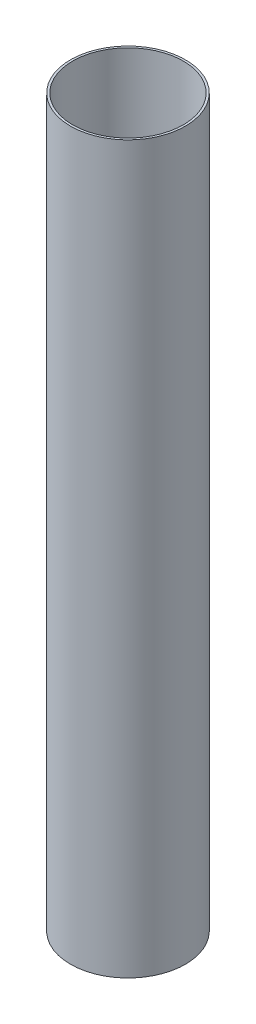
ISO-10303-21;
HEADER;
FILE_DESCRIPTION(('STEP AP214'),'2;1');
FILE_NAME('part.step','',(''),(''),'','','');
FILE_SCHEMA(('AUTOMOTIVE_DESIGN { 1 0 10303 214 1 1 1 1 }'));
ENDSEC;
DATA;
#1=APPLICATION_CONTEXT('core data for automotive mechanical design processes');
#2=APPLICATION_PROTOCOL_DEFINITION('international standard','automotive_design',2000,#1);
#3=PRODUCT_CONTEXT('',#1,'mechanical');
#4=PRODUCT('Part','Part','',(#3));
#5=PRODUCT_RELATED_PRODUCT_CATEGORY('part','',(#4));
#6=PRODUCT_DEFINITION_FORMATION('','',#4);
#7=PRODUCT_DEFINITION_CONTEXT('part definition',#1,'design');
#8=PRODUCT_DEFINITION('design','',#6,#7);
#9=PRODUCT_DEFINITION_SHAPE('','',#8);
#10=(LENGTH_UNIT() NAMED_UNIT(*) SI_UNIT(.MILLI.,.METRE.));
#11=(NAMED_UNIT(*) PLANE_ANGLE_UNIT() SI_UNIT($,.RADIAN.));
#12=(NAMED_UNIT(*) SI_UNIT($,.STERADIAN.) SOLID_ANGLE_UNIT());
#13=UNCERTAINTY_MEASURE_WITH_UNIT(LENGTH_MEASURE(1.E-05),#10,'distance_accuracy_value','');
#14=(GEOMETRIC_REPRESENTATION_CONTEXT(3) GLOBAL_UNCERTAINTY_ASSIGNED_CONTEXT((#13)) GLOBAL_UNIT_ASSIGNED_CONTEXT((#10,
#11,#12)) REPRESENTATION_CONTEXT('',''));
#15=CARTESIAN_POINT('',(0.,0.,0.));
#16=DIRECTION('',(0.,0.,1.));
#17=DIRECTION('',(1.,0.,0.));
#18=AXIS2_PLACEMENT_3D('',#15,#16,#17);
#19=CARTESIAN_POINT('',(0.,500.,0.));
#20=DIRECTION('',(0.,1.,0.));
#21=DIRECTION('',(0.,0.,1.));
#22=AXIS2_PLACEMENT_3D('',#19,#20,#21);
#23=PLANE('',#22);
#24=CARTESIAN_POINT('',(0.,500.,0.));
#25=DIRECTION('',(0.,1.,0.));
#26=DIRECTION('',(0.,0.,1.));
#27=AXIS2_PLACEMENT_3D('',#24,#25,#26);
#28=CIRCLE('',#27,39.6);
#29=CARTESIAN_POINT('',(0.,500.,39.6));
#30=VERTEX_POINT('',#29);
#31=EDGE_CURVE('E10',#30,#30,#28,.T.);
#32=ORIENTED_EDGE('',*,*,#31,.T.);
#33=EDGE_LOOP('',(#32));
#34=FACE_BOUND('',#33,.T.);
#35=CARTESIAN_POINT('',(0.,500.,0.));
#36=DIRECTION('',(0.,1.,0.));
#37=DIRECTION('',(0.,0.,1.));
#38=AXIS2_PLACEMENT_3D('',#35,#36,#37);
#39=CIRCLE('',#38,38.1);
#40=CARTESIAN_POINT('',(0.,500.,38.1));
#41=VERTEX_POINT('',#40);
#42=EDGE_CURVE('E51',#41,#41,#39,.T.);
#43=ORIENTED_EDGE('',*,*,#42,.F.);
#44=EDGE_LOOP('',(#43));
#45=FACE_BOUND('',#44,.T.);
#46=ADVANCED_FACE('F33',(#34,#45),#23,.T.);
#47=CARTESIAN_POINT('',(0.,0.,0.));
#48=DIRECTION('',(0.,1.,0.));
#49=DIRECTION('',(0.,0.,1.));
#50=AXIS2_PLACEMENT_3D('',#47,#48,#49);
#51=PLANE('',#50);
#52=CARTESIAN_POINT('',(0.,0.,0.));
#53=DIRECTION('',(0.,1.,0.));
#54=DIRECTION('',(0.,0.,1.));
#55=AXIS2_PLACEMENT_3D('',#52,#53,#54);
#56=CIRCLE('',#55,39.6);
#57=CARTESIAN_POINT('',(0.,0.,39.6));
#58=VERTEX_POINT('',#57);
#59=EDGE_CURVE('E46',#58,#58,#56,.T.);
#60=ORIENTED_EDGE('',*,*,#59,.F.);
#61=EDGE_LOOP('',(#60));
#62=FACE_BOUND('',#61,.T.);
#63=CARTESIAN_POINT('',(0.,0.,0.));
#64=DIRECTION('',(0.,1.,0.));
#65=DIRECTION('',(0.,0.,1.));
#66=AXIS2_PLACEMENT_3D('',#63,#64,#65);
#67=CIRCLE('',#66,38.1);
#68=CARTESIAN_POINT('',(0.,0.,38.1));
#69=VERTEX_POINT('',#68);
#70=EDGE_CURVE('E53',#69,#69,#67,.T.);
#71=ORIENTED_EDGE('',*,*,#70,.T.);
#72=EDGE_LOOP('',(#71));
#73=FACE_BOUND('',#72,.T.);
#74=ADVANCED_FACE('F73',(#62,#73),#51,.F.);
#75=CARTESIAN_POINT('',(0.,500.,0.));
#76=DIRECTION('',(0.,-1.,0.));
#77=DIRECTION('',(0.,0.,-1.));
#78=AXIS2_PLACEMENT_3D('',#75,#76,#77);
#79=CYLINDRICAL_SURFACE('',#78,39.6);
#80=CARTESIAN_POINT('',(-39.5494627017865,289.,-2.));
#81=CARTESIAN_POINT('',(-39.5494633805638,288.887736012651,-1.99999504587905));
#82=CARTESIAN_POINT('',(-39.549945843696,288.775392447069,-1.99051584970761));
#83=CARTESIAN_POINT('',(-39.5518239004202,288.553804592069,-1.95283595262459));
#84=CARTESIAN_POINT('',(-39.5532205694095,288.444564110966,-1.92461320275257));
#85=CARTESIAN_POINT('',(-39.5567684293352,288.232424406619,-1.85025641437459));
#86=CARTESIAN_POINT('',(-39.5589192350897,288.129521977642,-1.80413151826624));
#87=CARTESIAN_POINT('',(-39.5637325299873,287.932948066749,-1.69529381609789));
#88=CARTESIAN_POINT('',(-39.5663948984394,287.839274415393,-1.63258492132482));
#89=CARTESIAN_POINT('',(-39.5719344549867,287.663692768875,-1.49228741624869));
#90=CARTESIAN_POINT('',(-39.5748118346272,287.581795459373,-1.41468543939056));
#91=CARTESIAN_POINT('',(-39.5804553835984,287.432182374286,-1.24683135036733));
#92=CARTESIAN_POINT('',(-39.5832215483825,287.364467178025,-1.15657872168844));
#93=CARTESIAN_POINT('',(-39.5883324321443,287.245111062589,-0.965929298706174));
#94=CARTESIAN_POINT('',(-39.5906769325991,287.193478467966,-0.865527286451762));
#95=CARTESIAN_POINT('',(-39.59467835378,287.107806643397,-0.657465875900605));
#96=CARTESIAN_POINT('',(-39.5963352797874,287.073767278318,-0.549806533354495));
#97=CARTESIAN_POINT('',(-39.5987735538844,287.024276396142,-0.330384833901967));
#98=CARTESIAN_POINT('',(-39.5995556550983,287.008808889952,-0.218626091859429));
#99=CARTESIAN_POINT('',(-39.6001586710762,286.996851446529,0.00590408443600667));
#100=CARTESIAN_POINT('',(-39.5999795935225,287.00036135762,0.118675510587931));
#101=CARTESIAN_POINT('',(-39.5986810661567,287.026245848579,0.341921619670142));
#102=CARTESIAN_POINT('',(-39.5975624742331,287.048603218541,0.45239830370022));
#103=CARTESIAN_POINT('',(-39.5945118998958,287.111521304833,0.668028545321534));
#104=CARTESIAN_POINT('',(-39.5925799140208,287.152082098622,0.773182080259608));
#105=CARTESIAN_POINT('',(-39.5881186965578,287.250275277546,0.975236506326441));
#106=CARTESIAN_POINT('',(-39.5855891908089,287.307915502356,1.07213358128004));
#107=CARTESIAN_POINT('',(-39.5802177883049,287.438625623174,1.25488282436368));
#108=CARTESIAN_POINT('',(-39.5773758892964,287.511695630481,1.3407349128165));
#109=CARTESIAN_POINT('',(-39.5716959872028,287.67128841554,1.49905753215065));
#110=CARTESIAN_POINT('',(-39.5688579920121,287.757826124816,1.57151301285575));
#111=CARTESIAN_POINT('',(-39.5635090345074,287.941845375337,1.70086972649381));
#112=CARTESIAN_POINT('',(-39.5609980722815,288.039326919536,1.75777095523065));
#113=CARTESIAN_POINT('',(-39.5565865844047,288.242475796353,1.85440264149443));
#114=CARTESIAN_POINT('',(-39.5546860789604,288.348143399792,1.89413253065161));
#115=CARTESIAN_POINT('',(-39.551710595398,288.564660765748,1.95528368710619));
#116=CARTESIAN_POINT('',(-39.5506356109452,288.675510488492,1.97670509489862));
#117=CARTESIAN_POINT('',(-39.5494335672349,288.899114365366,2.00061259424068));
#118=CARTESIAN_POINT('',(-39.5493054621971,289.011866280577,2.00311957588068));
#119=CARTESIAN_POINT('',(-39.5500088934241,289.236189175193,1.98918157644529));
#120=CARTESIAN_POINT('',(-39.5508404264499,289.347760158582,1.97273665933819));
#121=CARTESIAN_POINT('',(-39.5533684580109,289.566495403161,1.92137900035167));
#122=CARTESIAN_POINT('',(-39.5550645085958,289.673661915484,1.88647582227807));
#123=CARTESIAN_POINT('',(-39.5591300351847,289.880615503453,1.79920209433135));
#124=CARTESIAN_POINT('',(-39.5614995151658,289.980402535512,1.74683144129611));
#125=CARTESIAN_POINT('',(-39.5666473849614,290.169860676133,1.62605576855342));
#126=CARTESIAN_POINT('',(-39.5694261318023,290.259522830308,1.55763671773181));
#127=CARTESIAN_POINT('',(-39.5750780885359,290.426095957461,1.40672691157965));
#128=CARTESIAN_POINT('',(-39.5779512990441,290.50300684735,1.3242360645638));
#129=CARTESIAN_POINT('',(-39.5834714039456,290.641964439014,1.14743454819508));
#130=CARTESIAN_POINT('',(-39.586118091485,290.703997646139,1.05311326535953));
#131=CARTESIAN_POINT('',(-39.5908839104221,290.811346719011,0.855381951928465));
#132=CARTESIAN_POINT('',(-39.5930030441506,290.85666265862,0.751971961492803));
#133=CARTESIAN_POINT('',(-39.5964739417287,290.929267252047,0.539048841782955));
#134=CARTESIAN_POINT('',(-39.5978260728767,290.95656453558,0.429538661377598));
#135=CARTESIAN_POINT('',(-39.5996120427221,290.992385207519,0.207482473658431));
#136=CARTESIAN_POINT('',(-39.6000458867397,291.000908704693,0.0949364839364978));
#137=CARTESIAN_POINT('',(-39.5999464123695,290.998938814893,-0.129862626807726));
#138=CARTESIAN_POINT('',(-39.5994141704439,290.988466593924,-0.242115934398369));
#139=CARTESIAN_POINT('',(-39.5974445600472,290.948846293923,-0.463268516234429));
#140=CARTESIAN_POINT('',(-39.5960071898745,290.919698179786,-0.572167784174643));
#141=CARTESIAN_POINT('',(-39.5923890304609,290.843557850397,-0.783525415372076));
#142=CARTESIAN_POINT('',(-39.5902082360714,290.796565511564,-0.885983734016159));
#143=CARTESIAN_POINT('',(-39.5853484727192,290.686074312056,-1.08155784342284));
#144=CARTESIAN_POINT('',(-39.582669518964,290.622575955236,-1.17467391924253));
#145=CARTESIAN_POINT('',(-39.5771115452285,290.480799321402,-1.34902612360988));
#146=CARTESIAN_POINT('',(-39.5742323270256,290.402506265098,-1.43025022732235));
#147=CARTESIAN_POINT('',(-39.5685996844676,290.233372865268,-1.57842742405221));
#148=CARTESIAN_POINT('',(-39.5658462912308,290.142529439967,-1.64537700162206));
#149=CARTESIAN_POINT('',(-39.5607739696856,289.950801377624,-1.7631367669671));
#150=CARTESIAN_POINT('',(-39.5584554653329,289.849907087562,-1.81393123898208));
#151=CARTESIAN_POINT('',(-39.5545210984327,289.641086126657,-1.89779871956403));
#152=CARTESIAN_POINT('',(-39.5529044066169,289.533167929751,-1.93089265404534));
#153=CARTESIAN_POINT('',(-39.5509839051267,289.353816329351,-1.96974185182653));
#154=CARTESIAN_POINT('',(-39.5504159708997,289.283544541887,-1.98107416404735));
#155=CARTESIAN_POINT('',(-39.5496551544123,289.142192479211,-1.99620480389874));
#156=CARTESIAN_POINT('',(-39.5494622718236,289.071112204706,-2.00000313812534));
#157=CARTESIAN_POINT('',(-39.5494627017865,289.,-2.));
#158=B_SPLINE_CURVE_WITH_KNOTS('',3,(#80,#81,#82,#83,#84,#85,#86,#87,#88,#89,#90,#91,#92,#93,
#94,#95,#96,#97,#98,#99,#100,#101,#102,#103,#104,#105,#106,#107,#108,#109,#110,#111,#112,#113,
#114,#115,#116,#117,#118,#119,#120,#121,#122,#123,#124,#125,#126,#127,#128,#129,#130,#131,#132,
#133,#134,#135,#136,#137,#138,#139,#140,#141,#142,#143,#144,#145,#146,#147,#148,#149,#150,#151,
#152,#153,#154,#155,#156,#157),.UNSPECIFIED.,.T.,.F.,(4,2,2,2,2,2,2,2,2,2,2,2,2,2,2,2,2,2,2,2,2,
2,2,2,2,2,2,2,2,2,2,2,2,2,2,2,2,2,4),(0.,0.336532374480321,0.673461331350422,1.0102184488246,
1.3468962138512,1.68387757266052,2.02087269410049,2.35804195956893,2.6952086352063,
3.03208482491551,3.36895832217809,3.70552454780732,4.04209220560529,4.37881459215503,
4.71553940764409,5.05264024204067,5.38974116737817,5.72685324987093,6.0639627454208,
6.40069986487463,6.73743584774375,7.07399752779827,7.41056119560618,7.74742022512118,
8.08428144953761,8.42144707458375,8.75861120988654,9.09561374904253,9.43261433575894,
9.76923964973545,10.1058655964895,10.4424938746211,10.7791118781877,11.1160679440222,
11.4531068978362,11.7904727288725,12.1274388330164,12.3406112013016,12.5537833829536),.UNSPECIFIED.);
#159=CARTESIAN_POINT('',(-39.5494627017865,289.,-2.));
#160=VERTEX_POINT('',#159);
#161=EDGE_CURVE('E58',#160,#160,#158,.T.);
#162=ORIENTED_EDGE('',*,*,#161,.F.);
#163=EDGE_LOOP('',(#162));
#164=FACE_BOUND('',#163,.T.);
#165=ORIENTED_EDGE('',*,*,#31,.F.);
#166=EDGE_LOOP('',(#165));
#167=FACE_BOUND('',#166,.T.);
#168=ORIENTED_EDGE('',*,*,#59,.T.);
#169=EDGE_LOOP('',(#168));
#170=FACE_BOUND('',#169,.T.);
#171=ADVANCED_FACE('F35',(#164,#167,#170),#79,.T.);
#172=CARTESIAN_POINT('',(0.,500.,0.));
#173=DIRECTION('',(0.,-1.,0.));
#174=DIRECTION('',(0.,0.,-1.));
#175=AXIS2_PLACEMENT_3D('',#172,#173,#174);
#176=CYLINDRICAL_SURFACE('',#175,38.1);
#177=CARTESIAN_POINT('',(-38.0474703495515,289.,-2.));
#178=CARTESIAN_POINT('',(-38.0474710546729,289.112257811472,-1.99999504824444));
#179=CARTESIAN_POINT('',(-38.0479725095062,289.224595050209,-1.99051689069614));
#180=CARTESIAN_POINT('',(-38.0499244771662,289.446170001832,-1.95284136009362));
#181=CARTESIAN_POINT('',(-38.051376105727,289.555403913125,-1.92462197973472));
#182=CARTESIAN_POINT('',(-38.055063538444,289.767530443873,-1.85027466733129));
#183=CARTESIAN_POINT('',(-38.0572989402149,289.870426285452,-1.80415592343537));
#184=CARTESIAN_POINT('',(-38.0623015276112,290.066988324986,-1.69533327170803));
#185=CARTESIAN_POINT('',(-38.0650685883528,290.160656682626,-1.63263325742966));
#186=CARTESIAN_POINT('',(-38.0708261770562,290.336235738689,-1.49235126201491));
#187=CARTESIAN_POINT('',(-38.0738169182536,290.418134994641,-1.41475496691442));
#188=CARTESIAN_POINT('',(-38.0796828664911,290.567753391474,-1.24691190662658));
#189=CARTESIAN_POINT('',(-38.0825580687929,290.635471951259,-1.15666462328163));
#190=CARTESIAN_POINT('',(-38.0878706264306,290.754838894446,-0.966020556673349));
#191=CARTESIAN_POINT('',(-38.090307735729,290.80647825945,-0.86561811932207));
#192=CARTESIAN_POINT('',(-38.0944673048082,290.892163109295,-0.657553579932387));
#193=CARTESIAN_POINT('',(-38.0961897704042,290.926208737302,-0.549891536975467));
#194=CARTESIAN_POINT('',(-38.098724517484,290.975709166388,-0.330470140885539));
#195=CARTESIAN_POINT('',(-38.0995376446182,290.991181241157,-0.218714694538194));
#196=CARTESIAN_POINT('',(-38.1001649240089,291.003148683517,0.00580989691479037));
#197=CARTESIAN_POINT('',(-38.0999790847449,290.999644212187,0.118579033407787));
#198=CARTESIAN_POINT('',(-38.0986300839424,290.973772359198,0.341812932397973));
#199=CARTESIAN_POINT('',(-38.0974678856047,290.951423567817,0.452279856054705));
#200=CARTESIAN_POINT('',(-38.094298171997,290.888526298357,0.667892017040124));
#201=CARTESIAN_POINT('',(-38.0922906529168,290.847977738244,0.773037230379504));
#202=CARTESIAN_POINT('',(-38.0876547545013,290.74981078611,0.97508111150013));
#203=CARTESIAN_POINT('',(-38.0850260675225,290.692183932178,1.0719756605534));
#204=CARTESIAN_POINT('',(-38.0794438291461,290.561502382468,1.25472272253969));
#205=CARTESIAN_POINT('',(-38.0764902752068,290.488447565982,1.34057514907065));
#206=CARTESIAN_POINT('',(-38.0705866727919,290.328878772366,1.49890936775546));
#207=CARTESIAN_POINT('',(-38.0676366328434,290.242348665247,1.57137490546292));
#208=CARTESIAN_POINT('',(-38.062076216131,290.058342199417,1.70075307877792));
#209=CARTESIAN_POINT('',(-38.0594658394647,289.960865837566,1.75766570992631));
#210=CARTESIAN_POINT('',(-38.0548793976098,289.757723952842,1.85432115775649));
#211=CARTESIAN_POINT('',(-38.0529033554951,289.652058132252,1.8940633498848));
#212=CARTESIAN_POINT('',(-38.049809293279,289.435541280845,1.95523886176805));
#213=CARTESIAN_POINT('',(-38.0486912660644,289.324690293023,1.97667233330474));
#214=CARTESIAN_POINT('',(-38.0474406331002,289.101091388368,2.000601856092));
#215=CARTESIAN_POINT('',(-38.0473068530827,288.988345892893,2.00312047400902));
#216=CARTESIAN_POINT('',(-38.0480367349632,288.764033909175,1.98920769857108));
#217=CARTESIAN_POINT('',(-38.0489003932195,288.65246741663,1.97277637440304));
#218=CARTESIAN_POINT('',(-38.0515267397444,288.433743868603,1.92144886157481));
#219=CARTESIAN_POINT('',(-38.0532889245172,288.326584379927,1.88656301363007));
#220=CARTESIAN_POINT('',(-38.0575132873922,288.119641722654,1.79932720118943));
#221=CARTESIAN_POINT('',(-38.0599754699645,288.019858601165,1.74697712516991));
#222=CARTESIAN_POINT('',(-38.0653251822079,287.830397363387,1.62624101088173));
#223=CARTESIAN_POINT('',(-38.0682131128087,287.740728914199,1.55783982084899));
#224=CARTESIAN_POINT('',(-38.0740874227916,287.574139646967,1.40696525810436));
#225=CARTESIAN_POINT('',(-38.0770738028636,287.497218918284,1.32449178675551));
#226=CARTESIAN_POINT('',(-38.0828118626823,287.358232684494,1.14771681877241));
#227=CARTESIAN_POINT('',(-38.085563310365,287.296181760828,1.05340384918464));
#228=CARTESIAN_POINT('',(-38.0905181043043,287.188796234988,0.85568501990969));
#229=CARTESIAN_POINT('',(-38.0927214531285,287.143461554508,0.752279202819859));
#230=CARTESIAN_POINT('',(-38.0963306314498,287.070820873179,0.539364117196021));
#231=CARTESIAN_POINT('',(-38.0977368727362,287.043505562249,0.429858032258716));
#232=CARTESIAN_POINT('',(-38.099594997294,287.007648516355,0.207806369349553));
#233=CARTESIAN_POINT('',(-38.1000468866774,286.999106661159,0.0952608108480825));
#234=CARTESIAN_POINT('',(-38.0999454073661,287.001040139863,-0.129530397813853));
#235=CARTESIAN_POINT('',(-38.0993932471833,287.011492611464,-0.241776245882476));
#236=CARTESIAN_POINT('',(-38.0973482007726,287.051070749542,-0.462917101544345));
#237=CARTESIAN_POINT('',(-38.0958553127914,287.080196450819,-0.571812102892352));
#238=CARTESIAN_POINT('',(-38.0920967402758,287.156289494421,-0.783164634778044));
#239=CARTESIAN_POINT('',(-38.0898310517601,287.203256928662,-0.885622132147983));
#240=CARTESIAN_POINT('',(-38.0847816081437,287.313696433619,-1.08119919158481));
#241=CARTESIAN_POINT('',(-38.0819978684971,287.377168012017,-1.17431903207928));
#242=CARTESIAN_POINT('',(-38.0762217464145,287.518896600715,-1.34869209117097));
#243=CARTESIAN_POINT('',(-38.0732291392658,287.597169695064,-1.42993222880055));
#244=CARTESIAN_POINT('',(-38.067374161198,287.766266073008,-1.57814507251644));
#245=CARTESIAN_POINT('',(-38.0645118224714,287.857092436661,-1.64511426681493));
#246=CARTESIAN_POINT('',(-38.0592381499375,288.048794419643,-1.76291891456051));
#247=CARTESIAN_POINT('',(-38.056827274757,288.149680100214,-1.81373799777493));
#248=CARTESIAN_POINT('',(-38.0527355823806,288.358489383148,-1.89765550865308));
#249=CARTESIAN_POINT('',(-38.051053904616,288.466404515608,-1.93077483563258));
#250=CARTESIAN_POINT('',(-38.0490548295057,288.645823578622,-1.96967976640889));
#251=CARTESIAN_POINT('',(-38.0484632762815,288.716165789106,-1.98103530385916));
#252=CARTESIAN_POINT('',(-38.0476708129232,288.857661354013,-1.99619698707609));
#253=CARTESIAN_POINT('',(-38.0474699024176,288.928814707665,-2.00000314002351));
#254=CARTESIAN_POINT('',(-38.0474703495515,289.,-2.));
#255=B_SPLINE_CURVE_WITH_KNOTS('',3,(#177,#178,#179,#180,#181,#182,#183,#184,#185,#186,#187,
#188,#189,#190,#191,#192,#193,#194,#195,#196,#197,#198,#199,#200,#201,#202,#203,#204,#205,#206,
#207,#208,#209,#210,#211,#212,#213,#214,#215,#216,#217,#218,#219,#220,#221,#222,#223,#224,#225,
#226,#227,#228,#229,#230,#231,#232,#233,#234,#235,#236,#237,#238,#239,#240,#241,#242,#243,#244,
#245,#246,#247,#248,#249,#250,#251,#252,#253,#254),.UNSPECIFIED.,.T.,.F.,(4,2,2,2,2,2,2,2,2,2,2,
2,2,2,2,2,2,2,2,2,2,2,2,2,2,2,2,2,2,2,2,2,2,2,2,2,2,2,4),(0.,0.336513577634106,
0.673423014300279,1.0101597359731,1.34681745646643,1.68380030833231,2.02079696633469,
2.35798229784577,2.69516488554305,3.03203364469976,3.36889954440982,3.70543350783241,
4.04196898815416,4.37867149380355,4.71537663391157,5.05248795435353,5.38959937144799,
5.72672304952111,6.06384393276684,6.40056254459729,6.73727992705986,7.07380883453108,
7.41033989106021,7.74718990974858,8.08404228961934,8.42122365000227,8.7584034308727,
9.09540886411222,9.43241213906013,9.7690100526179,10.1056085934819,10.4422088684495,
10.7787991037801,11.1157572184167,11.4527981560576,11.7901796467297,12.1271618828131,
12.3405531815528,12.5539442773203),.UNSPECIFIED.);
#256=CARTESIAN_POINT('',(-38.0474703495515,289.,-2.));
#257=VERTEX_POINT('',#256);
#258=EDGE_CURVE('E37',#257,#257,#255,.T.);
#259=ORIENTED_EDGE('',*,*,#258,.F.);
#260=EDGE_LOOP('',(#259));
#261=FACE_BOUND('',#260,.T.);
#262=ORIENTED_EDGE('',*,*,#42,.T.);
#263=EDGE_LOOP('',(#262));
#264=FACE_BOUND('',#263,.T.);
#265=ORIENTED_EDGE('',*,*,#70,.F.);
#266=EDGE_LOOP('',(#265));
#267=FACE_BOUND('',#266,.T.);
#268=ADVANCED_FACE('F67',(#261,#264,#267),#176,.F.);
#269=CARTESIAN_POINT('',(-39.601,289.,0.));
#270=DIRECTION('',(1.,0.,0.));
#271=DIRECTION('',(0.,0.,-1.));
#272=AXIS2_PLACEMENT_3D('',#269,#270,#271);
#273=CYLINDRICAL_SURFACE('',#272,2.);
#274=ORIENTED_EDGE('',*,*,#258,.T.);
#275=EDGE_LOOP('',(#274));
#276=FACE_BOUND('',#275,.T.);
#277=ORIENTED_EDGE('',*,*,#161,.T.);
#278=EDGE_LOOP('',(#277));
#279=FACE_BOUND('',#278,.T.);
#280=ADVANCED_FACE('F64',(#276,#279),#273,.F.);
#281=CLOSED_SHELL('',(#46,#74,#171,#268,#280));
#282=MANIFOLD_SOLID_BREP('B2',#281);
#283=ADVANCED_BREP_SHAPE_REPRESENTATION('',(#18,#282),#14);
#284=SHAPE_DEFINITION_REPRESENTATION(#9,#283);
ENDSEC;
END-ISO-10303-21;
